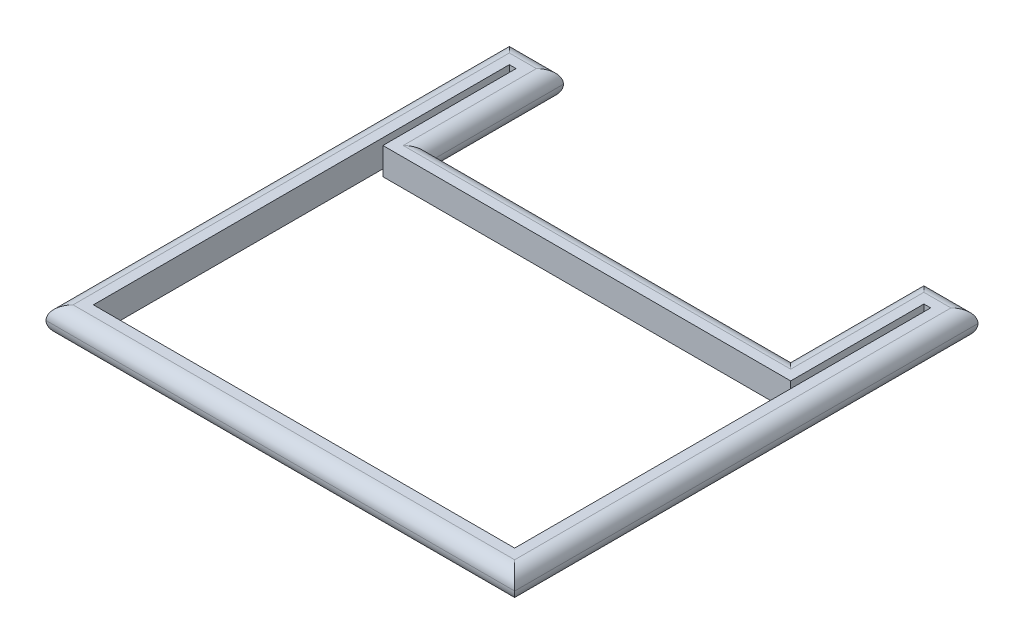
ISO-10303-21;
HEADER;
FILE_DESCRIPTION(('STEP AP214'),'2;1');
FILE_NAME('part.step','',(''),(''),'','','');
FILE_SCHEMA(('AUTOMOTIVE_DESIGN { 1 0 10303 214 1 1 1 1 }'));
ENDSEC;
DATA;
#1=APPLICATION_CONTEXT('core data for automotive mechanical design processes');
#2=APPLICATION_PROTOCOL_DEFINITION('international standard','automotive_design',2000,#1);
#3=PRODUCT_CONTEXT('',#1,'mechanical');
#4=PRODUCT('Part','Part','',(#3));
#5=PRODUCT_RELATED_PRODUCT_CATEGORY('part','',(#4));
#6=PRODUCT_DEFINITION_FORMATION('','',#4);
#7=PRODUCT_DEFINITION_CONTEXT('part definition',#1,'design');
#8=PRODUCT_DEFINITION('design','',#6,#7);
#9=PRODUCT_DEFINITION_SHAPE('','',#8);
#10=(LENGTH_UNIT() NAMED_UNIT(*) SI_UNIT(.MILLI.,.METRE.));
#11=(NAMED_UNIT(*) PLANE_ANGLE_UNIT() SI_UNIT($,.RADIAN.));
#12=(NAMED_UNIT(*) SI_UNIT($,.STERADIAN.) SOLID_ANGLE_UNIT());
#13=UNCERTAINTY_MEASURE_WITH_UNIT(LENGTH_MEASURE(1.E-05),#10,'distance_accuracy_value','');
#14=(GEOMETRIC_REPRESENTATION_CONTEXT(3) GLOBAL_UNCERTAINTY_ASSIGNED_CONTEXT((#13)) GLOBAL_UNIT_ASSIGNED_CONTEXT((#10,
#11,#12)) REPRESENTATION_CONTEXT('',''));
#15=CARTESIAN_POINT('',(0.,0.,0.));
#16=DIRECTION('',(0.,0.,1.));
#17=DIRECTION('',(1.,0.,0.));
#18=AXIS2_PLACEMENT_3D('',#15,#16,#17);
#19=CARTESIAN_POINT('',(-191.35,25.4,0.));
#20=DIRECTION('',(-1.,0.,0.));
#21=DIRECTION('',(0.,0.,1.));
#22=AXIS2_PLACEMENT_3D('',#19,#20,#21);
#23=PLANE('',#22);
#24=DIRECTION('',(0.,0.,-1.));
#25=VECTOR('',#24,1.);
#26=CARTESIAN_POINT('',(-191.35,0.,0.));
#27=LINE('',#26,#25);
#28=CARTESIAN_POINT('',(-191.35,0.,-132.7));
#29=VERTEX_POINT('',#28);
#30=CARTESIAN_POINT('',(-191.35,0.,-257.700000096));
#31=VERTEX_POINT('',#30);
#32=EDGE_CURVE('E276',#29,#31,#27,.T.);
#33=ORIENTED_EDGE('',*,*,#32,.F.);
#34=DIRECTION('',(0.,-1.,0.));
#35=VECTOR('',#34,1.);
#36=CARTESIAN_POINT('',(-191.35,25.4,-132.7));
#37=LINE('',#36,#35);
#38=CARTESIAN_POINT('',(-191.35,25.4,-132.7));
#39=VERTEX_POINT('',#38);
#40=EDGE_CURVE('E102',#39,#29,#37,.T.);
#41=ORIENTED_EDGE('',*,*,#40,.F.);
#42=DIRECTION('',(0.,0.,-1.));
#43=VECTOR('',#42,1.);
#44=CARTESIAN_POINT('',(-191.35,25.4,0.));
#45=LINE('',#44,#43);
#46=CARTESIAN_POINT('',(-191.35,25.4,-257.700000096));
#47=VERTEX_POINT('',#46);
#48=EDGE_CURVE('E312',#39,#47,#45,.T.);
#49=ORIENTED_EDGE('',*,*,#48,.T.);
#50=DIRECTION('',(0.,-1.,0.));
#51=VECTOR('',#50,1.);
#52=CARTESIAN_POINT('',(-191.35,25.4,-257.700000096));
#53=LINE('',#52,#51);
#54=EDGE_CURVE('E313',#47,#31,#53,.T.);
#55=ORIENTED_EDGE('',*,*,#54,.T.);
#56=EDGE_LOOP('',(#33,#41,#49,#55));
#57=FACE_BOUND('',#56,.T.);
#58=ADVANCED_FACE('F41',(#57),#23,.T.);
#59=CARTESIAN_POINT('',(0.,25.4,-132.7));
#60=DIRECTION('',(0.,0.,-1.));
#61=DIRECTION('',(-1.,0.,0.));
#62=AXIS2_PLACEMENT_3D('',#59,#60,#61);
#63=PLANE('',#62);
#64=DIRECTION('',(1.,0.,0.));
#65=VECTOR('',#64,1.);
#66=CARTESIAN_POINT('',(0.,0.,-132.7));
#67=LINE('',#66,#65);
#68=CARTESIAN_POINT('',(191.35,0.,-132.7));
#69=VERTEX_POINT('',#68);
#70=EDGE_CURVE('E279',#29,#69,#67,.T.);
#71=ORIENTED_EDGE('',*,*,#70,.T.);
#72=DIRECTION('',(0.,-1.,0.));
#73=VECTOR('',#72,1.);
#74=CARTESIAN_POINT('',(191.35,25.4,-132.7));
#75=LINE('',#74,#73);
#76=CARTESIAN_POINT('',(191.35,25.4,-132.7));
#77=VERTEX_POINT('',#76);
#78=EDGE_CURVE('E333',#77,#69,#75,.T.);
#79=ORIENTED_EDGE('',*,*,#78,.F.);
#80=DIRECTION('',(1.,0.,0.));
#81=VECTOR('',#80,1.);
#82=CARTESIAN_POINT('',(0.,25.4,-132.7));
#83=LINE('',#82,#81);
#84=EDGE_CURVE('E394',#39,#77,#83,.T.);
#85=ORIENTED_EDGE('',*,*,#84,.F.);
#86=ORIENTED_EDGE('',*,*,#40,.T.);
#87=EDGE_LOOP('',(#71,#79,#85,#86));
#88=FACE_BOUND('',#87,.T.);
#89=ADVANCED_FACE('F446',(#88),#63,.F.);
#90=CARTESIAN_POINT('',(191.35,25.4,0.));
#91=DIRECTION('',(-1.,0.,0.));
#92=DIRECTION('',(0.,0.,1.));
#93=AXIS2_PLACEMENT_3D('',#90,#91,#92);
#94=PLANE('',#93);
#95=DIRECTION('',(0.,0.,-1.));
#96=VECTOR('',#95,1.);
#97=CARTESIAN_POINT('',(191.35,0.,0.));
#98=LINE('',#97,#96);
#99=CARTESIAN_POINT('',(191.35,0.,-257.700000096));
#100=VERTEX_POINT('',#99);
#101=EDGE_CURVE('E285',#69,#100,#98,.T.);
#102=ORIENTED_EDGE('',*,*,#101,.T.);
#103=DIRECTION('',(0.,-1.,0.));
#104=VECTOR('',#103,1.);
#105=CARTESIAN_POINT('',(191.35,25.4,-257.700000096));
#106=LINE('',#105,#104);
#107=CARTESIAN_POINT('',(191.35,25.4,-257.700000096));
#108=VERTEX_POINT('',#107);
#109=EDGE_CURVE('E329',#108,#100,#106,.T.);
#110=ORIENTED_EDGE('',*,*,#109,.F.);
#111=DIRECTION('',(0.,0.,-1.));
#112=VECTOR('',#111,1.);
#113=CARTESIAN_POINT('',(191.35,25.4,0.));
#114=LINE('',#113,#112);
#115=EDGE_CURVE('E390',#77,#108,#114,.T.);
#116=ORIENTED_EDGE('',*,*,#115,.F.);
#117=ORIENTED_EDGE('',*,*,#78,.T.);
#118=EDGE_LOOP('',(#102,#110,#116,#117));
#119=FACE_BOUND('',#118,.T.);
#120=ADVANCED_FACE('F445',(#119),#94,.F.);
#121=CARTESIAN_POINT('',(0.,25.4,-257.700000096));
#122=DIRECTION('',(0.,0.,-1.));
#123=DIRECTION('',(-1.,0.,0.));
#124=AXIS2_PLACEMENT_3D('',#121,#122,#123);
#125=PLANE('',#124);
#126=DIRECTION('',(1.,0.,0.));
#127=VECTOR('',#126,1.);
#128=CARTESIAN_POINT('',(0.,0.,-257.700000096));
#129=LINE('',#128,#127);
#130=CARTESIAN_POINT('',(197.7,0.,-257.700000096));
#131=VERTEX_POINT('',#130);
#132=EDGE_CURVE('E293',#100,#131,#129,.T.);
#133=ORIENTED_EDGE('',*,*,#132,.T.);
#134=DIRECTION('',(0.,-1.,0.));
#135=VECTOR('',#134,1.);
#136=CARTESIAN_POINT('',(197.7,25.4,-257.700000096));
#137=LINE('',#136,#135);
#138=CARTESIAN_POINT('',(197.7,25.4,-257.700000096));
#139=VERTEX_POINT('',#138);
#140=EDGE_CURVE('E326',#139,#131,#137,.T.);
#141=ORIENTED_EDGE('',*,*,#140,.F.);
#142=DIRECTION('',(1.,0.,0.));
#143=VECTOR('',#142,1.);
#144=CARTESIAN_POINT('',(0.,25.4,-257.700000096));
#145=LINE('',#144,#143);
#146=EDGE_CURVE('E386',#108,#139,#145,.T.);
#147=ORIENTED_EDGE('',*,*,#146,.F.);
#148=ORIENTED_EDGE('',*,*,#109,.T.);
#149=EDGE_LOOP('',(#133,#141,#147,#148));
#150=FACE_BOUND('',#149,.T.);
#151=ADVANCED_FACE('F440',(#150),#125,.F.);
#152=CARTESIAN_POINT('',(197.7,25.4,0.));
#153=DIRECTION('',(-1.,0.,0.));
#154=DIRECTION('',(0.,0.,1.));
#155=AXIS2_PLACEMENT_3D('',#152,#153,#154);
#156=PLANE('',#155);
#157=DIRECTION('',(0.,0.,-1.));
#158=VECTOR('',#157,1.);
#159=CARTESIAN_POINT('',(197.7,0.,0.));
#160=LINE('',#159,#158);
#161=CARTESIAN_POINT('',(197.7,0.,132.7));
#162=VERTEX_POINT('',#161);
#163=EDGE_CURVE('E297',#162,#131,#160,.T.);
#164=ORIENTED_EDGE('',*,*,#163,.F.);
#165=DIRECTION('',(0.,-1.,0.));
#166=VECTOR('',#165,1.);
#167=CARTESIAN_POINT('',(197.7,25.4,132.7));
#168=LINE('',#167,#166);
#169=CARTESIAN_POINT('',(197.7,25.4,132.7));
#170=VERTEX_POINT('',#169);
#171=EDGE_CURVE('E323',#170,#162,#168,.T.);
#172=ORIENTED_EDGE('',*,*,#171,.F.);
#173=DIRECTION('',(0.,0.,-1.));
#174=VECTOR('',#173,1.);
#175=CARTESIAN_POINT('',(197.7,25.4,0.));
#176=LINE('',#175,#174);
#177=EDGE_CURVE('E382',#170,#139,#176,.T.);
#178=ORIENTED_EDGE('',*,*,#177,.T.);
#179=ORIENTED_EDGE('',*,*,#140,.T.);
#180=EDGE_LOOP('',(#164,#172,#178,#179));
#181=FACE_BOUND('',#180,.T.);
#182=ADVANCED_FACE('F435',(#181),#156,.T.);
#183=CARTESIAN_POINT('',(0.,25.4,132.7));
#184=DIRECTION('',(0.,0.,-1.));
#185=DIRECTION('',(-1.,0.,0.));
#186=AXIS2_PLACEMENT_3D('',#183,#184,#185);
#187=PLANE('',#186);
#188=DIRECTION('',(1.,0.,0.));
#189=VECTOR('',#188,1.);
#190=CARTESIAN_POINT('',(0.,0.,132.7));
#191=LINE('',#190,#189);
#192=CARTESIAN_POINT('',(-197.7,0.,132.7));
#193=VERTEX_POINT('',#192);
#194=EDGE_CURVE('E301',#193,#162,#191,.T.);
#195=ORIENTED_EDGE('',*,*,#194,.F.);
#196=DIRECTION('',(0.,-1.,0.));
#197=VECTOR('',#196,1.);
#198=CARTESIAN_POINT('',(-197.7,25.4,132.7));
#199=LINE('',#198,#197);
#200=CARTESIAN_POINT('',(-197.7,25.4,132.7));
#201=VERTEX_POINT('',#200);
#202=EDGE_CURVE('E320',#201,#193,#199,.T.);
#203=ORIENTED_EDGE('',*,*,#202,.F.);
#204=DIRECTION('',(1.,0.,0.));
#205=VECTOR('',#204,1.);
#206=CARTESIAN_POINT('',(0.,25.4,132.7));
#207=LINE('',#206,#205);
#208=EDGE_CURVE('E379',#201,#170,#207,.T.);
#209=ORIENTED_EDGE('',*,*,#208,.T.);
#210=ORIENTED_EDGE('',*,*,#171,.T.);
#211=EDGE_LOOP('',(#195,#203,#209,#210));
#212=FACE_BOUND('',#211,.T.);
#213=ADVANCED_FACE('F432',(#212),#187,.T.);
#214=CARTESIAN_POINT('',(-197.7,25.4,0.));
#215=DIRECTION('',(-1.,0.,0.));
#216=DIRECTION('',(0.,0.,1.));
#217=AXIS2_PLACEMENT_3D('',#214,#215,#216);
#218=PLANE('',#217);
#219=DIRECTION('',(0.,0.,-1.));
#220=VECTOR('',#219,1.);
#221=CARTESIAN_POINT('',(-197.7,0.,0.));
#222=LINE('',#221,#220);
#223=CARTESIAN_POINT('',(-197.7,0.,-257.700000096));
#224=VERTEX_POINT('',#223);
#225=EDGE_CURVE('E305',#193,#224,#222,.T.);
#226=ORIENTED_EDGE('',*,*,#225,.T.);
#227=DIRECTION('',(0.,-1.,0.));
#228=VECTOR('',#227,1.);
#229=CARTESIAN_POINT('',(-197.7,25.4,-257.700000096));
#230=LINE('',#229,#228);
#231=CARTESIAN_POINT('',(-197.7,25.4,-257.700000096));
#232=VERTEX_POINT('',#231);
#233=EDGE_CURVE('E316',#232,#224,#230,.T.);
#234=ORIENTED_EDGE('',*,*,#233,.F.);
#235=DIRECTION('',(0.,0.,-1.));
#236=VECTOR('',#235,1.);
#237=CARTESIAN_POINT('',(-197.7,25.4,0.));
#238=LINE('',#237,#236);
#239=EDGE_CURVE('E376',#201,#232,#238,.T.);
#240=ORIENTED_EDGE('',*,*,#239,.F.);
#241=ORIENTED_EDGE('',*,*,#202,.T.);
#242=EDGE_LOOP('',(#226,#234,#240,#241));
#243=FACE_BOUND('',#242,.T.);
#244=ADVANCED_FACE('F425',(#243),#218,.F.);
#245=CARTESIAN_POINT('',(0.,25.4,-257.700000096));
#246=DIRECTION('',(0.,0.,-1.));
#247=DIRECTION('',(-1.,0.,0.));
#248=AXIS2_PLACEMENT_3D('',#245,#246,#247);
#249=PLANE('',#248);
#250=DIRECTION('',(1.,0.,0.));
#251=VECTOR('',#250,1.);
#252=CARTESIAN_POINT('',(0.,0.,-257.700000096));
#253=LINE('',#252,#251);
#254=EDGE_CURVE('E308',#224,#31,#253,.T.);
#255=ORIENTED_EDGE('',*,*,#254,.T.);
#256=ORIENTED_EDGE('',*,*,#54,.F.);
#257=DIRECTION('',(1.,0.,0.));
#258=VECTOR('',#257,1.);
#259=CARTESIAN_POINT('',(0.,25.4,-257.700000096));
#260=LINE('',#259,#258);
#261=EDGE_CURVE('E288',#232,#47,#260,.T.);
#262=ORIENTED_EDGE('',*,*,#261,.F.);
#263=ORIENTED_EDGE('',*,*,#233,.T.);
#264=EDGE_LOOP('',(#255,#256,#262,#263));
#265=FACE_BOUND('',#264,.T.);
#266=ADVANCED_FACE('F428',(#265),#249,.F.);
#267=CARTESIAN_POINT('',(0.,25.4,0.));
#268=DIRECTION('',(0.,1.,0.));
#269=DIRECTION('',(0.,0.,1.));
#270=AXIS2_PLACEMENT_3D('',#267,#268,#269);
#271=PLANE('',#270);
#272=DIRECTION('',(0.,0.,-1.));
#273=VECTOR('',#272,1.);
#274=CARTESIAN_POINT('',(-207.225,25.4,0.));
#275=LINE('',#274,#273);
#276=CARTESIAN_POINT('',(-207.225,25.4,-267.225000096));
#277=VERTEX_POINT('',#276);
#278=CARTESIAN_POINT('',(-207.225,25.4,142.225));
#279=VERTEX_POINT('',#278);
#280=EDGE_CURVE('E52',#277,#279,#275,.F.);
#281=ORIENTED_EDGE('',*,*,#280,.T.);
#282=DIRECTION('',(1.,0.,0.));
#283=VECTOR('',#282,1.);
#284=CARTESIAN_POINT('',(219.925,25.4,142.225));
#285=LINE('',#284,#283);
#286=CARTESIAN_POINT('',(207.225,25.4,142.225));
#287=VERTEX_POINT('',#286);
#288=EDGE_CURVE('E11',#279,#287,#285,.T.);
#289=ORIENTED_EDGE('',*,*,#288,.T.);
#290=DIRECTION('',(0.,0.,-1.));
#291=VECTOR('',#290,1.);
#292=CARTESIAN_POINT('',(207.225,25.4,-279.925000096));
#293=LINE('',#292,#291);
#294=CARTESIAN_POINT('',(207.225,25.4,-267.225000096));
#295=VERTEX_POINT('',#294);
#296=EDGE_CURVE('E370',#287,#295,#293,.T.);
#297=ORIENTED_EDGE('',*,*,#296,.T.);
#298=DIRECTION('',(1.,0.,0.));
#299=VECTOR('',#298,1.);
#300=CARTESIAN_POINT('',(0.,25.4,-267.225000096));
#301=LINE('',#300,#299);
#302=CARTESIAN_POINT('',(181.825,25.4,-267.225000096));
#303=VERTEX_POINT('',#302);
#304=EDGE_CURVE('E367',#295,#303,#301,.F.);
#305=ORIENTED_EDGE('',*,*,#304,.T.);
#306=DIRECTION('',(0.,0.,-1.));
#307=VECTOR('',#306,1.);
#308=CARTESIAN_POINT('',(181.825,25.4,0.));
#309=LINE('',#308,#307);
#310=CARTESIAN_POINT('',(181.825,25.4,-142.225));
#311=VERTEX_POINT('',#310);
#312=EDGE_CURVE('E364',#303,#311,#309,.F.);
#313=ORIENTED_EDGE('',*,*,#312,.T.);
#314=DIRECTION('',(1.,0.,0.));
#315=VECTOR('',#314,1.);
#316=CARTESIAN_POINT('',(0.,25.4,-142.225));
#317=LINE('',#316,#315);
#318=CARTESIAN_POINT('',(-181.825,25.4,-142.225));
#319=VERTEX_POINT('',#318);
#320=EDGE_CURVE('E174',#311,#319,#317,.F.);
#321=ORIENTED_EDGE('',*,*,#320,.T.);
#322=DIRECTION('',(0.,0.,-1.));
#323=VECTOR('',#322,1.);
#324=CARTESIAN_POINT('',(-181.825,25.4,-279.925000096));
#325=LINE('',#324,#323);
#326=CARTESIAN_POINT('',(-181.825,25.4,-267.225000096));
#327=VERTEX_POINT('',#326);
#328=EDGE_CURVE('E167',#319,#327,#325,.T.);
#329=ORIENTED_EDGE('',*,*,#328,.T.);
#330=DIRECTION('',(1.,0.,0.));
#331=VECTOR('',#330,1.);
#332=CARTESIAN_POINT('',(0.,25.4,-267.225000096));
#333=LINE('',#332,#331);
#334=EDGE_CURVE('E172',#327,#277,#333,.F.);
#335=ORIENTED_EDGE('',*,*,#334,.T.);
#336=EDGE_LOOP('',(#281,#289,#297,#305,#313,#321,#329,#335));
#337=FACE_BOUND('',#336,.T.);
#338=ORIENTED_EDGE('',*,*,#48,.F.);
#339=ORIENTED_EDGE('',*,*,#84,.T.);
#340=ORIENTED_EDGE('',*,*,#115,.T.);
#341=ORIENTED_EDGE('',*,*,#146,.T.);
#342=ORIENTED_EDGE('',*,*,#177,.F.);
#343=ORIENTED_EDGE('',*,*,#208,.F.);
#344=ORIENTED_EDGE('',*,*,#239,.T.);
#345=ORIENTED_EDGE('',*,*,#261,.T.);
#346=EDGE_LOOP('',(#338,#339,#340,#341,#342,#343,#344,#345));
#347=FACE_BOUND('',#346,.T.);
#348=ADVANCED_FACE('F169',(#337,#347),#271,.T.);
#349=CARTESIAN_POINT('',(0.,0.,0.));
#350=DIRECTION('',(0.,1.,0.));
#351=DIRECTION('',(0.,0.,1.));
#352=AXIS2_PLACEMENT_3D('',#349,#350,#351);
#353=PLANE('',#352);
#354=DIRECTION('',(0.,0.,-1.));
#355=VECTOR('',#354,1.);
#356=CARTESIAN_POINT('',(207.225,0.,0.));
#357=LINE('',#356,#355);
#358=CARTESIAN_POINT('',(207.225,0.,-267.225000096));
#359=VERTEX_POINT('',#358);
#360=CARTESIAN_POINT('',(207.225,0.,142.225));
#361=VERTEX_POINT('',#360);
#362=EDGE_CURVE('E345',#359,#361,#357,.F.);
#363=ORIENTED_EDGE('',*,*,#362,.T.);
#364=DIRECTION('',(1.,0.,0.));
#365=VECTOR('',#364,1.);
#366=CARTESIAN_POINT('',(0.,0.,142.225));
#367=LINE('',#366,#365);
#368=CARTESIAN_POINT('',(-207.225,0.,142.225));
#369=VERTEX_POINT('',#368);
#370=EDGE_CURVE('E360',#361,#369,#367,.F.);
#371=ORIENTED_EDGE('',*,*,#370,.T.);
#372=DIRECTION('',(0.,0.,-1.));
#373=VECTOR('',#372,1.);
#374=CARTESIAN_POINT('',(-207.225,0.,-279.925000096));
#375=LINE('',#374,#373);
#376=CARTESIAN_POINT('',(-207.225,0.,-267.225000096));
#377=VERTEX_POINT('',#376);
#378=EDGE_CURVE('E357',#369,#377,#375,.T.);
#379=ORIENTED_EDGE('',*,*,#378,.T.);
#380=DIRECTION('',(1.,0.,0.));
#381=VECTOR('',#380,1.);
#382=CARTESIAN_POINT('',(-169.125,0.,-267.225000096));
#383=LINE('',#382,#381);
#384=CARTESIAN_POINT('',(-181.825,0.,-267.225000096));
#385=VERTEX_POINT('',#384);
#386=EDGE_CURVE('E354',#377,#385,#383,.T.);
#387=ORIENTED_EDGE('',*,*,#386,.T.);
#388=DIRECTION('',(0.,0.,-1.));
#389=VECTOR('',#388,1.);
#390=CARTESIAN_POINT('',(-181.825,0.,0.));
#391=LINE('',#390,#389);
#392=CARTESIAN_POINT('',(-181.825,0.,-142.225));
#393=VERTEX_POINT('',#392);
#394=EDGE_CURVE('E351',#385,#393,#391,.F.);
#395=ORIENTED_EDGE('',*,*,#394,.T.);
#396=DIRECTION('',(1.,0.,0.));
#397=VECTOR('',#396,1.);
#398=CARTESIAN_POINT('',(169.125,0.,-142.225));
#399=LINE('',#398,#397);
#400=CARTESIAN_POINT('',(181.825,0.,-142.225));
#401=VERTEX_POINT('',#400);
#402=EDGE_CURVE('E348',#393,#401,#399,.T.);
#403=ORIENTED_EDGE('',*,*,#402,.T.);
#404=DIRECTION('',(0.,0.,-1.));
#405=VECTOR('',#404,1.);
#406=CARTESIAN_POINT('',(181.825,0.,-279.925000096));
#407=LINE('',#406,#405);
#408=CARTESIAN_POINT('',(181.825,0.,-267.225000096));
#409=VERTEX_POINT('',#408);
#410=EDGE_CURVE('E339',#401,#409,#407,.T.);
#411=ORIENTED_EDGE('',*,*,#410,.T.);
#412=DIRECTION('',(1.,0.,0.));
#413=VECTOR('',#412,1.);
#414=CARTESIAN_POINT('',(219.925,0.,-267.225000096));
#415=LINE('',#414,#413);
#416=EDGE_CURVE('E342',#409,#359,#415,.T.);
#417=ORIENTED_EDGE('',*,*,#416,.T.);
#418=EDGE_LOOP('',(#363,#371,#379,#387,#395,#403,#411,#417));
#419=FACE_BOUND('',#418,.T.);
#420=ORIENTED_EDGE('',*,*,#32,.T.);
#421=ORIENTED_EDGE('',*,*,#254,.F.);
#422=ORIENTED_EDGE('',*,*,#225,.F.);
#423=ORIENTED_EDGE('',*,*,#194,.T.);
#424=ORIENTED_EDGE('',*,*,#163,.T.);
#425=ORIENTED_EDGE('',*,*,#132,.F.);
#426=ORIENTED_EDGE('',*,*,#101,.F.);
#427=ORIENTED_EDGE('',*,*,#70,.F.);
#428=EDGE_LOOP('',(#420,#421,#422,#423,#424,#425,#426,#427));
#429=FACE_BOUND('',#428,.T.);
#430=ADVANCED_FACE('F429',(#419,#429),#353,.F.);
#431=CARTESIAN_POINT('',(0.,12.7,-142.225));
#432=DIRECTION('',(1.,0.,0.));
#433=DIRECTION('',(0.,0.,-1.));
#434=AXIS2_PLACEMENT_3D('',#431,#432,#433);
#435=CYLINDRICAL_SURFACE('',#434,12.7);
#436=CARTESIAN_POINT('',(-181.825,12.7,-142.225));
#437=DIRECTION('',(0.707106781186547,0.,0.707106781186547));
#438=DIRECTION('',(-0.707106781186547,0.,0.707106781186547));
#439=AXIS2_PLACEMENT_3D('',#436,#437,#438);
#440=ELLIPSE('',#439,17.9605122421383,12.7);
#441=CARTESIAN_POINT('',(-169.125,12.7,-154.925));
#442=VERTEX_POINT('',#441);
#443=EDGE_CURVE('E45',#319,#442,#440,.F.);
#444=ORIENTED_EDGE('',*,*,#443,.F.);
#445=ORIENTED_EDGE('',*,*,#320,.F.);
#446=CARTESIAN_POINT('',(181.825,12.7,-142.225));
#447=DIRECTION('',(0.707106781186547,0.,-0.707106781186547));
#448=DIRECTION('',(0.707106781186547,0.,0.707106781186547));
#449=AXIS2_PLACEMENT_3D('',#446,#447,#448);
#450=ELLIPSE('',#449,17.9605122421383,12.7);
#451=CARTESIAN_POINT('',(169.125,12.7,-154.925));
#452=VERTEX_POINT('',#451);
#453=EDGE_CURVE('E88',#452,#311,#450,.T.);
#454=ORIENTED_EDGE('',*,*,#453,.F.);
#455=DIRECTION('',(1.,0.,0.));
#456=VECTOR('',#455,1.);
#457=CARTESIAN_POINT('',(0.,12.7,-154.925));
#458=LINE('',#457,#456);
#459=EDGE_CURVE('E269',#442,#452,#458,.T.);
#460=ORIENTED_EDGE('',*,*,#459,.F.);
#461=EDGE_LOOP('',(#444,#445,#454,#460));
#462=FACE_BOUND('',#461,.T.);
#463=ADVANCED_FACE('F43',(#462),#435,.T.);
#464=CARTESIAN_POINT('',(-181.825,12.7,0.));
#465=DIRECTION('',(0.,0.,1.));
#466=DIRECTION('',(1.,0.,0.));
#467=AXIS2_PLACEMENT_3D('',#464,#465,#466);
#468=CYLINDRICAL_SURFACE('',#467,12.7);
#469=ORIENTED_EDGE('',*,*,#328,.F.);
#470=ORIENTED_EDGE('',*,*,#443,.T.);
#471=DIRECTION('',(0.,0.,-1.));
#472=VECTOR('',#471,1.);
#473=CARTESIAN_POINT('',(-169.125,12.7,-154.925));
#474=LINE('',#473,#472);
#475=CARTESIAN_POINT('',(-169.125,12.7,-279.925000096));
#476=VERTEX_POINT('',#475);
#477=EDGE_CURVE('E181',#476,#442,#474,.F.);
#478=ORIENTED_EDGE('',*,*,#477,.F.);
#479=CARTESIAN_POINT('',(-181.825,12.7,-267.225000096));
#480=DIRECTION('',(0.707106781186547,0.,0.707106781186547));
#481=DIRECTION('',(-0.707106781186547,0.,0.707106781186547));
#482=AXIS2_PLACEMENT_3D('',#479,#480,#481);
#483=ELLIPSE('',#482,17.9605122421383,12.7);
#484=EDGE_CURVE('E178',#327,#476,#483,.F.);
#485=ORIENTED_EDGE('',*,*,#484,.F.);
#486=EDGE_LOOP('',(#469,#470,#478,#485));
#487=FACE_BOUND('',#486,.T.);
#488=ADVANCED_FACE('F179',(#487),#468,.T.);
#489=CARTESIAN_POINT('',(181.825,12.7,0.));
#490=DIRECTION('',(0.,0.,-1.));
#491=DIRECTION('',(-1.,0.,0.));
#492=AXIS2_PLACEMENT_3D('',#489,#490,#491);
#493=CYLINDRICAL_SURFACE('',#492,12.7);
#494=ORIENTED_EDGE('',*,*,#453,.T.);
#495=ORIENTED_EDGE('',*,*,#312,.F.);
#496=CARTESIAN_POINT('',(181.825,12.7,-267.225000096));
#497=DIRECTION('',(0.707106781186547,0.,-0.707106781186547));
#498=DIRECTION('',(-0.707106781186547,0.,-0.707106781186547));
#499=AXIS2_PLACEMENT_3D('',#496,#497,#498);
#500=ELLIPSE('',#499,17.9605122421383,12.7);
#501=CARTESIAN_POINT('',(169.125,12.7,-279.925000096));
#502=VERTEX_POINT('',#501);
#503=EDGE_CURVE('E185',#502,#303,#500,.T.);
#504=ORIENTED_EDGE('',*,*,#503,.F.);
#505=DIRECTION('',(0.,0.,-1.));
#506=VECTOR('',#505,1.);
#507=CARTESIAN_POINT('',(169.125,12.7,0.));
#508=LINE('',#507,#506);
#509=EDGE_CURVE('E256',#452,#502,#508,.T.);
#510=ORIENTED_EDGE('',*,*,#509,.F.);
#511=EDGE_LOOP('',(#494,#495,#504,#510));
#512=FACE_BOUND('',#511,.T.);
#513=ADVANCED_FACE('F506',(#512),#493,.T.);
#514=CARTESIAN_POINT('',(0.,12.7,-142.225));
#515=DIRECTION('',(-1.,0.,0.));
#516=DIRECTION('',(0.,0.,1.));
#517=AXIS2_PLACEMENT_3D('',#514,#515,#516);
#518=CYLINDRICAL_SURFACE('',#517,12.7);
#519=CARTESIAN_POINT('',(181.825,12.7,-142.225));
#520=DIRECTION('',(-0.707106781186547,0.,0.707106781186547));
#521=DIRECTION('',(-0.707106781186547,0.,-0.707106781186547));
#522=AXIS2_PLACEMENT_3D('',#519,#520,#521);
#523=ELLIPSE('',#522,17.9605122421383,12.7);
#524=EDGE_CURVE('E252',#401,#452,#523,.F.);
#525=ORIENTED_EDGE('',*,*,#524,.F.);
#526=ORIENTED_EDGE('',*,*,#402,.F.);
#527=CARTESIAN_POINT('',(-181.825,12.7,-142.225));
#528=DIRECTION('',(-0.707106781186547,0.,-0.707106781186547));
#529=DIRECTION('',(0.707106781186547,0.,-0.707106781186547));
#530=AXIS2_PLACEMENT_3D('',#527,#528,#529);
#531=ELLIPSE('',#530,17.9605122421383,12.7);
#532=EDGE_CURVE('E265',#442,#393,#531,.T.);
#533=ORIENTED_EDGE('',*,*,#532,.F.);
#534=ORIENTED_EDGE('',*,*,#459,.T.);
#535=EDGE_LOOP('',(#525,#526,#533,#534));
#536=FACE_BOUND('',#535,.T.);
#537=ADVANCED_FACE('F502',(#536),#518,.T.);
#538=CARTESIAN_POINT('',(-181.825,12.7,0.));
#539=DIRECTION('',(0.,0.,-1.));
#540=DIRECTION('',(-1.,0.,0.));
#541=AXIS2_PLACEMENT_3D('',#538,#539,#540);
#542=CYLINDRICAL_SURFACE('',#541,12.7);
#543=ORIENTED_EDGE('',*,*,#532,.T.);
#544=ORIENTED_EDGE('',*,*,#394,.F.);
#545=CARTESIAN_POINT('',(-181.825,12.7,-267.225000096));
#546=DIRECTION('',(-0.707106781186547,0.,-0.707106781186547));
#547=DIRECTION('',(0.707106781186547,0.,-0.707106781186547));
#548=AXIS2_PLACEMENT_3D('',#545,#546,#547);
#549=ELLIPSE('',#548,17.9605122421383,12.7);
#550=EDGE_CURVE('E248',#476,#385,#549,.T.);
#551=ORIENTED_EDGE('',*,*,#550,.F.);
#552=ORIENTED_EDGE('',*,*,#477,.T.);
#553=EDGE_LOOP('',(#543,#544,#551,#552));
#554=FACE_BOUND('',#553,.T.);
#555=ADVANCED_FACE('F499',(#554),#542,.T.);
#556=CARTESIAN_POINT('',(0.,12.7,-267.225000096));
#557=DIRECTION('',(1.,0.,0.));
#558=DIRECTION('',(0.,0.,-1.));
#559=AXIS2_PLACEMENT_3D('',#556,#557,#558);
#560=CYLINDRICAL_SURFACE('',#559,12.7);
#561=ORIENTED_EDGE('',*,*,#334,.F.);
#562=ORIENTED_EDGE('',*,*,#484,.T.);
#563=DIRECTION('',(1.,0.,0.));
#564=VECTOR('',#563,1.);
#565=CARTESIAN_POINT('',(0.,12.7,-279.925000096));
#566=LINE('',#565,#564);
#567=CARTESIAN_POINT('',(-219.925,12.7,-279.925000096));
#568=VERTEX_POINT('',#567);
#569=EDGE_CURVE('E244',#568,#476,#566,.T.);
#570=ORIENTED_EDGE('',*,*,#569,.F.);
#571=CARTESIAN_POINT('',(-207.225,12.7,-267.225000096));
#572=DIRECTION('',(0.707106781186547,0.,-0.707106781186547));
#573=DIRECTION('',(0.707106781186547,0.,0.707106781186547));
#574=AXIS2_PLACEMENT_3D('',#571,#572,#573);
#575=ELLIPSE('',#574,17.9605122421383,12.7);
#576=EDGE_CURVE('E189',#277,#568,#575,.F.);
#577=ORIENTED_EDGE('',*,*,#576,.F.);
#578=EDGE_LOOP('',(#561,#562,#570,#577));
#579=FACE_BOUND('',#578,.T.);
#580=ADVANCED_FACE('F187',(#579),#560,.T.);
#581=CARTESIAN_POINT('',(0.,12.7,-267.225000096));
#582=DIRECTION('',(1.,0.,0.));
#583=DIRECTION('',(0.,0.,-1.));
#584=AXIS2_PLACEMENT_3D('',#581,#582,#583);
#585=CYLINDRICAL_SURFACE('',#584,12.7);
#586=ORIENTED_EDGE('',*,*,#503,.T.);
#587=ORIENTED_EDGE('',*,*,#304,.F.);
#588=CARTESIAN_POINT('',(207.225,12.7,-267.225000096));
#589=DIRECTION('',(0.707106781186547,0.,0.707106781186547));
#590=DIRECTION('',(0.707106781186547,0.,-0.707106781186547));
#591=AXIS2_PLACEMENT_3D('',#588,#589,#590);
#592=ELLIPSE('',#591,17.9605122421383,12.7);
#593=CARTESIAN_POINT('',(219.925,12.7,-279.925000096));
#594=VERTEX_POINT('',#593);
#595=EDGE_CURVE('E238',#594,#295,#592,.T.);
#596=ORIENTED_EDGE('',*,*,#595,.F.);
#597=DIRECTION('',(1.,0.,0.));
#598=VECTOR('',#597,1.);
#599=CARTESIAN_POINT('',(0.,12.7,-279.925000096));
#600=LINE('',#599,#598);
#601=EDGE_CURVE('E234',#502,#594,#600,.T.);
#602=ORIENTED_EDGE('',*,*,#601,.F.);
#603=EDGE_LOOP('',(#586,#587,#596,#602));
#604=FACE_BOUND('',#603,.T.);
#605=ADVANCED_FACE('F492',(#604),#585,.T.);
#606=CARTESIAN_POINT('',(181.825,12.7,0.));
#607=DIRECTION('',(0.,0.,1.));
#608=DIRECTION('',(1.,0.,0.));
#609=AXIS2_PLACEMENT_3D('',#606,#607,#608);
#610=CYLINDRICAL_SURFACE('',#609,12.7);
#611=ORIENTED_EDGE('',*,*,#524,.T.);
#612=ORIENTED_EDGE('',*,*,#509,.T.);
#613=CARTESIAN_POINT('',(181.825,12.7,-267.225000096));
#614=DIRECTION('',(-0.707106781186547,0.,0.707106781186547));
#615=DIRECTION('',(0.707106781186547,0.,0.707106781186547));
#616=AXIS2_PLACEMENT_3D('',#613,#614,#615);
#617=ELLIPSE('',#616,17.9605122421383,12.7);
#618=EDGE_CURVE('E230',#409,#502,#617,.F.);
#619=ORIENTED_EDGE('',*,*,#618,.F.);
#620=ORIENTED_EDGE('',*,*,#410,.F.);
#621=EDGE_LOOP('',(#611,#612,#619,#620));
#622=FACE_BOUND('',#621,.T.);
#623=ADVANCED_FACE('F488',(#622),#610,.T.);
#624=CARTESIAN_POINT('',(0.,12.7,-267.225000096));
#625=DIRECTION('',(-1.,0.,0.));
#626=DIRECTION('',(0.,0.,1.));
#627=AXIS2_PLACEMENT_3D('',#624,#625,#626);
#628=CYLINDRICAL_SURFACE('',#627,12.7);
#629=ORIENTED_EDGE('',*,*,#550,.T.);
#630=ORIENTED_EDGE('',*,*,#386,.F.);
#631=CARTESIAN_POINT('',(-207.225,12.7,-267.225000096));
#632=DIRECTION('',(-0.707106781186547,0.,0.707106781186547));
#633=DIRECTION('',(-0.707106781186547,0.,-0.707106781186547));
#634=AXIS2_PLACEMENT_3D('',#631,#632,#633);
#635=ELLIPSE('',#634,17.9605122421383,12.7);
#636=EDGE_CURVE('E226',#568,#377,#635,.T.);
#637=ORIENTED_EDGE('',*,*,#636,.F.);
#638=ORIENTED_EDGE('',*,*,#569,.T.);
#639=EDGE_LOOP('',(#629,#630,#637,#638));
#640=FACE_BOUND('',#639,.T.);
#641=ADVANCED_FACE('F484',(#640),#628,.T.);
#642=CARTESIAN_POINT('',(-207.225,12.7,0.));
#643=DIRECTION('',(0.,0.,-1.));
#644=DIRECTION('',(-1.,0.,0.));
#645=AXIS2_PLACEMENT_3D('',#642,#643,#644);
#646=CYLINDRICAL_SURFACE('',#645,12.7);
#647=ORIENTED_EDGE('',*,*,#280,.F.);
#648=ORIENTED_EDGE('',*,*,#576,.T.);
#649=DIRECTION('',(0.,0.,-1.));
#650=VECTOR('',#649,1.);
#651=CARTESIAN_POINT('',(-219.925,12.7,0.));
#652=LINE('',#651,#650);
#653=CARTESIAN_POINT('',(-219.925,12.7,154.925));
#654=VERTEX_POINT('',#653);
#655=EDGE_CURVE('E222',#654,#568,#652,.T.);
#656=ORIENTED_EDGE('',*,*,#655,.F.);
#657=CARTESIAN_POINT('',(-207.225,12.7,142.225));
#658=DIRECTION('',(-0.707106781186547,0.,-0.707106781186547));
#659=DIRECTION('',(0.707106781186547,0.,-0.707106781186547));
#660=AXIS2_PLACEMENT_3D('',#657,#658,#659);
#661=ELLIPSE('',#660,17.9605122421383,12.7);
#662=EDGE_CURVE('E218',#279,#654,#661,.F.);
#663=ORIENTED_EDGE('',*,*,#662,.F.);
#664=EDGE_LOOP('',(#647,#648,#656,#663));
#665=FACE_BOUND('',#664,.T.);
#666=ADVANCED_FACE('F480',(#665),#646,.T.);
#667=CARTESIAN_POINT('',(207.225,12.7,0.));
#668=DIRECTION('',(0.,0.,1.));
#669=DIRECTION('',(1.,0.,0.));
#670=AXIS2_PLACEMENT_3D('',#667,#668,#669);
#671=CYLINDRICAL_SURFACE('',#670,12.7);
#672=ORIENTED_EDGE('',*,*,#595,.T.);
#673=ORIENTED_EDGE('',*,*,#296,.F.);
#674=CARTESIAN_POINT('',(207.225,12.7,142.225));
#675=DIRECTION('',(-0.707106781186547,0.,0.707106781186547));
#676=DIRECTION('',(0.707106781186547,0.,0.707106781186547));
#677=AXIS2_PLACEMENT_3D('',#674,#675,#676);
#678=ELLIPSE('',#677,17.9605122421383,12.7);
#679=CARTESIAN_POINT('',(219.925,12.7,154.925));
#680=VERTEX_POINT('',#679);
#681=EDGE_CURVE('E215',#680,#287,#678,.T.);
#682=ORIENTED_EDGE('',*,*,#681,.F.);
#683=DIRECTION('',(0.,0.,-1.));
#684=VECTOR('',#683,1.);
#685=CARTESIAN_POINT('',(219.925,12.7,154.925));
#686=LINE('',#685,#684);
#687=EDGE_CURVE('E211',#594,#680,#686,.F.);
#688=ORIENTED_EDGE('',*,*,#687,.F.);
#689=EDGE_LOOP('',(#672,#673,#682,#688));
#690=FACE_BOUND('',#689,.T.);
#691=ADVANCED_FACE('F476',(#690),#671,.T.);
#692=CARTESIAN_POINT('',(0.,12.7,-267.225000096));
#693=DIRECTION('',(-1.,0.,0.));
#694=DIRECTION('',(0.,0.,1.));
#695=AXIS2_PLACEMENT_3D('',#692,#693,#694);
#696=CYLINDRICAL_SURFACE('',#695,12.7);
#697=ORIENTED_EDGE('',*,*,#618,.T.);
#698=ORIENTED_EDGE('',*,*,#601,.T.);
#699=CARTESIAN_POINT('',(207.225,12.7,-267.225000096));
#700=DIRECTION('',(-0.707106781186547,0.,-0.707106781186547));
#701=DIRECTION('',(-0.707106781186547,0.,0.707106781186547));
#702=AXIS2_PLACEMENT_3D('',#699,#700,#701);
#703=ELLIPSE('',#702,17.9605122421383,12.7);
#704=EDGE_CURVE('E207',#359,#594,#703,.F.);
#705=ORIENTED_EDGE('',*,*,#704,.F.);
#706=ORIENTED_EDGE('',*,*,#416,.F.);
#707=EDGE_LOOP('',(#697,#698,#705,#706));
#708=FACE_BOUND('',#707,.T.);
#709=ADVANCED_FACE('F472',(#708),#696,.T.);
#710=CARTESIAN_POINT('',(-207.225,12.7,0.));
#711=DIRECTION('',(0.,0.,1.));
#712=DIRECTION('',(1.,0.,0.));
#713=AXIS2_PLACEMENT_3D('',#710,#711,#712);
#714=CYLINDRICAL_SURFACE('',#713,12.7);
#715=ORIENTED_EDGE('',*,*,#636,.T.);
#716=ORIENTED_EDGE('',*,*,#378,.F.);
#717=CARTESIAN_POINT('',(-207.225,12.7,142.225));
#718=DIRECTION('',(0.707106781186547,0.,0.707106781186547));
#719=DIRECTION('',(-0.707106781186547,0.,0.707106781186547));
#720=AXIS2_PLACEMENT_3D('',#717,#718,#719);
#721=ELLIPSE('',#720,17.9605122421383,12.7);
#722=EDGE_CURVE('E204',#654,#369,#721,.T.);
#723=ORIENTED_EDGE('',*,*,#722,.F.);
#724=ORIENTED_EDGE('',*,*,#655,.T.);
#725=EDGE_LOOP('',(#715,#716,#723,#724));
#726=FACE_BOUND('',#725,.T.);
#727=ADVANCED_FACE('F468',(#726),#714,.T.);
#728=CARTESIAN_POINT('',(0.,12.7,142.225));
#729=DIRECTION('',(-1.,0.,0.));
#730=DIRECTION('',(0.,0.,1.));
#731=AXIS2_PLACEMENT_3D('',#728,#729,#730);
#732=CYLINDRICAL_SURFACE('',#731,12.7);
#733=ORIENTED_EDGE('',*,*,#288,.F.);
#734=ORIENTED_EDGE('',*,*,#662,.T.);
#735=DIRECTION('',(1.,0.,0.));
#736=VECTOR('',#735,1.);
#737=CARTESIAN_POINT('',(-219.925,12.7,154.925));
#738=LINE('',#737,#736);
#739=EDGE_CURVE('E200',#680,#654,#738,.F.);
#740=ORIENTED_EDGE('',*,*,#739,.F.);
#741=ORIENTED_EDGE('',*,*,#681,.T.);
#742=EDGE_LOOP('',(#733,#734,#740,#741));
#743=FACE_BOUND('',#742,.T.);
#744=ADVANCED_FACE('F464',(#743),#732,.T.);
#745=CARTESIAN_POINT('',(207.225,12.7,0.));
#746=DIRECTION('',(0.,0.,-1.));
#747=DIRECTION('',(-1.,0.,0.));
#748=AXIS2_PLACEMENT_3D('',#745,#746,#747);
#749=CYLINDRICAL_SURFACE('',#748,12.7);
#750=ORIENTED_EDGE('',*,*,#704,.T.);
#751=ORIENTED_EDGE('',*,*,#687,.T.);
#752=CARTESIAN_POINT('',(207.225,12.7,142.225));
#753=DIRECTION('',(0.707106781186547,0.,-0.707106781186547));
#754=DIRECTION('',(-0.707106781186547,0.,-0.707106781186547));
#755=AXIS2_PLACEMENT_3D('',#752,#753,#754);
#756=ELLIPSE('',#755,17.9605122421383,12.7);
#757=EDGE_CURVE('E196',#361,#680,#756,.F.);
#758=ORIENTED_EDGE('',*,*,#757,.F.);
#759=ORIENTED_EDGE('',*,*,#362,.F.);
#760=EDGE_LOOP('',(#750,#751,#758,#759));
#761=FACE_BOUND('',#760,.T.);
#762=ADVANCED_FACE('F460',(#761),#749,.T.);
#763=CARTESIAN_POINT('',(0.,12.7,142.225));
#764=DIRECTION('',(1.,0.,0.));
#765=DIRECTION('',(0.,0.,-1.));
#766=AXIS2_PLACEMENT_3D('',#763,#764,#765);
#767=CYLINDRICAL_SURFACE('',#766,12.7);
#768=ORIENTED_EDGE('',*,*,#722,.T.);
#769=ORIENTED_EDGE('',*,*,#370,.F.);
#770=ORIENTED_EDGE('',*,*,#757,.T.);
#771=ORIENTED_EDGE('',*,*,#739,.T.);
#772=EDGE_LOOP('',(#768,#769,#770,#771));
#773=FACE_BOUND('',#772,.T.);
#774=ADVANCED_FACE('F457',(#773),#767,.T.);
#775=CLOSED_SHELL('',(#58,#89,#120,#151,#182,#213,#244,#266,#348,#430,#463,#488,#513,#537,#555,
#580,#605,#623,#641,#666,#691,#709,#727,#744,#762,#774));
#776=MANIFOLD_SOLID_BREP('B2',#775);
#777=ADVANCED_BREP_SHAPE_REPRESENTATION('',(#18,#776),#14);
#778=SHAPE_DEFINITION_REPRESENTATION(#9,#777);
ENDSEC;
END-ISO-10303-21;
